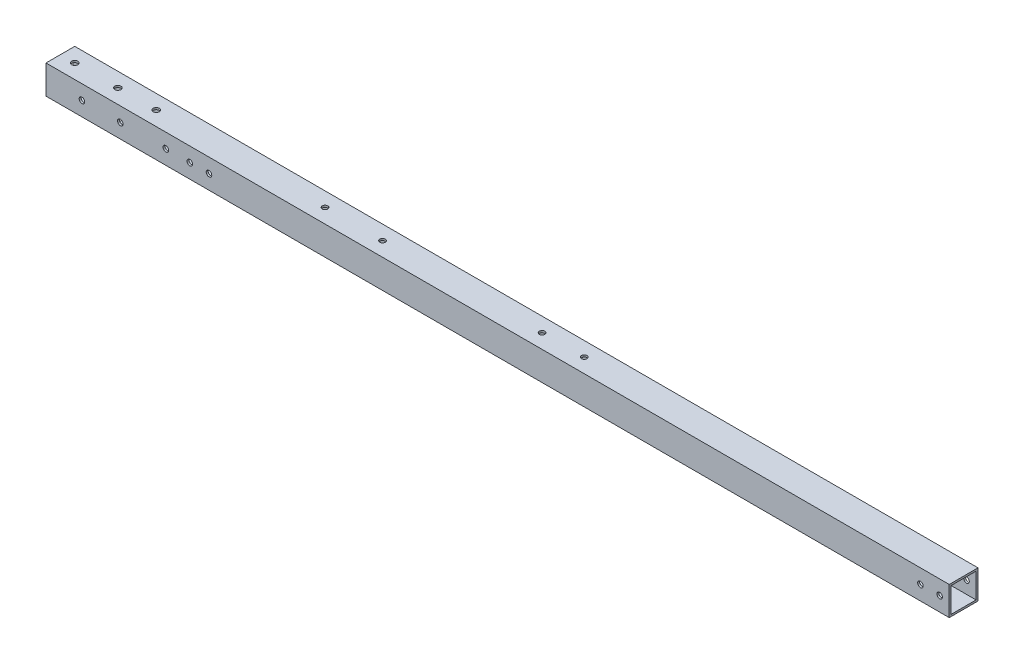
ISO-10303-21;
HEADER;
FILE_DESCRIPTION(('STEP AP214'),'2;1');
FILE_NAME('part.step','',(''),(''),'','','');
FILE_SCHEMA(('AUTOMOTIVE_DESIGN { 1 0 10303 214 1 1 1 1 }'));
ENDSEC;
DATA;
#1=APPLICATION_CONTEXT('core data for automotive mechanical design processes');
#2=APPLICATION_PROTOCOL_DEFINITION('international standard','automotive_design',2000,#1);
#3=PRODUCT_CONTEXT('',#1,'mechanical');
#4=PRODUCT('Part','Part','',(#3));
#5=PRODUCT_RELATED_PRODUCT_CATEGORY('part','',(#4));
#6=PRODUCT_DEFINITION_FORMATION('','',#4);
#7=PRODUCT_DEFINITION_CONTEXT('part definition',#1,'design');
#8=PRODUCT_DEFINITION('design','',#6,#7);
#9=PRODUCT_DEFINITION_SHAPE('','',#8);
#10=(LENGTH_UNIT() NAMED_UNIT(*) SI_UNIT(.MILLI.,.METRE.));
#11=(NAMED_UNIT(*) PLANE_ANGLE_UNIT() SI_UNIT($,.RADIAN.));
#12=(NAMED_UNIT(*) SI_UNIT($,.STERADIAN.) SOLID_ANGLE_UNIT());
#13=UNCERTAINTY_MEASURE_WITH_UNIT(LENGTH_MEASURE(1.E-05),#10,'distance_accuracy_value','');
#14=(GEOMETRIC_REPRESENTATION_CONTEXT(3) GLOBAL_UNCERTAINTY_ASSIGNED_CONTEXT((#13)) GLOBAL_UNIT_ASSIGNED_CONTEXT((#10,
#11,#12)) REPRESENTATION_CONTEXT('',''));
#15=CARTESIAN_POINT('',(0.,0.,0.));
#16=DIRECTION('',(0.,0.,1.));
#17=DIRECTION('',(1.,0.,0.));
#18=AXIS2_PLACEMENT_3D('',#15,#16,#17);
#19=CARTESIAN_POINT('',(235.5,-6.50000000000001,-6.49999999999999));
#20=DIRECTION('',(0.,0.,1.));
#21=DIRECTION('',(1.,0.,0.));
#22=AXIS2_PLACEMENT_3D('',#19,#20,#21);
#23=PLANE('',#22);
#24=CARTESIAN_POINT('',(230.5,0.,-6.49999999999999));
#25=DIRECTION('',(0.,0.,1.));
#26=DIRECTION('',(1.,0.,0.));
#27=AXIS2_PLACEMENT_3D('',#24,#25,#26);
#28=CIRCLE('',#27,1.45);
#29=CARTESIAN_POINT('',(231.95,0.,-6.49999999999999));
#30=VERTEX_POINT('',#29);
#31=EDGE_CURVE('E253',#30,#30,#28,.T.);
#32=ORIENTED_EDGE('',*,*,#31,.F.);
#33=EDGE_LOOP('',(#32));
#34=FACE_BOUND('',#33,.T.);
#35=CARTESIAN_POINT('',(220.5,0.,-6.49999999999999));
#36=DIRECTION('',(0.,0.,1.));
#37=DIRECTION('',(1.,0.,0.));
#38=AXIS2_PLACEMENT_3D('',#35,#36,#37);
#39=CIRCLE('',#38,1.45);
#40=CARTESIAN_POINT('',(221.95,0.,-6.49999999999999));
#41=VERTEX_POINT('',#40);
#42=EDGE_CURVE('E247',#41,#41,#39,.T.);
#43=ORIENTED_EDGE('',*,*,#42,.F.);
#44=EDGE_LOOP('',(#43));
#45=FACE_BOUND('',#44,.T.);
#46=CARTESIAN_POINT('',(-173.,0.,-6.49999999999999));
#47=DIRECTION('',(0.,0.,1.));
#48=DIRECTION('',(1.,0.,0.));
#49=AXIS2_PLACEMENT_3D('',#46,#47,#48);
#50=CIRCLE('',#49,1.45);
#51=CARTESIAN_POINT('',(-171.55,0.,-6.49999999999999));
#52=VERTEX_POINT('',#51);
#53=EDGE_CURVE('E289',#52,#52,#50,.T.);
#54=ORIENTED_EDGE('',*,*,#53,.F.);
#55=EDGE_LOOP('',(#54));
#56=FACE_BOUND('',#55,.T.);
#57=CARTESIAN_POINT('',(-160.5,0.,-6.49999999999999));
#58=DIRECTION('',(0.,0.,1.));
#59=DIRECTION('',(1.,0.,0.));
#60=AXIS2_PLACEMENT_3D('',#57,#58,#59);
#61=CIRCLE('',#60,1.45);
#62=CARTESIAN_POINT('',(-159.05,0.,-6.49999999999999));
#63=VERTEX_POINT('',#62);
#64=EDGE_CURVE('E283',#63,#63,#61,.T.);
#65=ORIENTED_EDGE('',*,*,#64,.F.);
#66=EDGE_LOOP('',(#65));
#67=FACE_BOUND('',#66,.T.);
#68=CARTESIAN_POINT('',(-150.5,0.,-6.49999999999999));
#69=DIRECTION('',(0.,0.,1.));
#70=DIRECTION('',(1.,0.,0.));
#71=AXIS2_PLACEMENT_3D('',#68,#69,#70);
#72=CIRCLE('',#71,1.45);
#73=CARTESIAN_POINT('',(-149.05,0.,-6.49999999999999));
#74=VERTEX_POINT('',#73);
#75=EDGE_CURVE('E277',#74,#74,#72,.T.);
#76=ORIENTED_EDGE('',*,*,#75,.F.);
#77=EDGE_LOOP('',(#76));
#78=FACE_BOUND('',#77,.T.);
#79=CARTESIAN_POINT('',(-216.75,0.,-6.49999999999999));
#80=DIRECTION('',(0.,0.,1.));
#81=DIRECTION('',(1.,0.,0.));
#82=AXIS2_PLACEMENT_3D('',#79,#80,#81);
#83=CIRCLE('',#82,1.45);
#84=CARTESIAN_POINT('',(-215.3,0.,-6.49999999999999));
#85=VERTEX_POINT('',#84);
#86=EDGE_CURVE('E313',#85,#85,#83,.T.);
#87=ORIENTED_EDGE('',*,*,#86,.F.);
#88=EDGE_LOOP('',(#87));
#89=FACE_BOUND('',#88,.T.);
#90=CARTESIAN_POINT('',(-196.75,0.,-6.49999999999999));
#91=DIRECTION('',(0.,0.,1.));
#92=DIRECTION('',(1.,0.,0.));
#93=AXIS2_PLACEMENT_3D('',#90,#91,#92);
#94=CIRCLE('',#93,1.45);
#95=CARTESIAN_POINT('',(-195.3,0.,-6.49999999999999));
#96=VERTEX_POINT('',#95);
#97=EDGE_CURVE('E307',#96,#96,#94,.T.);
#98=ORIENTED_EDGE('',*,*,#97,.F.);
#99=EDGE_LOOP('',(#98));
#100=FACE_BOUND('',#99,.T.);
#101=DIRECTION('',(0.,1.,0.));
#102=VECTOR('',#101,1.);
#103=CARTESIAN_POINT('',(-235.5,-6.50000000000001,-6.49999999999999));
#104=LINE('',#103,#102);
#105=CARTESIAN_POINT('',(-235.5,-6.50000000000001,-6.49999999999999));
#106=VERTEX_POINT('',#105);
#107=CARTESIAN_POINT('',(-235.5,6.49999999999999,-6.49999999999999));
#108=VERTEX_POINT('',#107);
#109=EDGE_CURVE('E166',#106,#108,#104,.T.);
#110=ORIENTED_EDGE('',*,*,#109,.F.);
#111=DIRECTION('',(-1.,0.,0.));
#112=VECTOR('',#111,1.);
#113=CARTESIAN_POINT('',(235.5,-6.50000000000001,-6.49999999999999));
#114=LINE('',#113,#112);
#115=CARTESIAN_POINT('',(235.5,-6.50000000000001,-6.49999999999999));
#116=VERTEX_POINT('',#115);
#117=EDGE_CURVE('E12',#116,#106,#114,.T.);
#118=ORIENTED_EDGE('',*,*,#117,.F.);
#119=DIRECTION('',(0.,1.,0.));
#120=VECTOR('',#119,1.);
#121=CARTESIAN_POINT('',(235.5,-6.50000000000001,-6.49999999999999));
#122=LINE('',#121,#120);
#123=CARTESIAN_POINT('',(235.5,6.49999999999999,-6.49999999999999));
#124=VERTEX_POINT('',#123);
#125=EDGE_CURVE('E147',#116,#124,#122,.T.);
#126=ORIENTED_EDGE('',*,*,#125,.T.);
#127=DIRECTION('',(-1.,0.,0.));
#128=VECTOR('',#127,1.);
#129=CARTESIAN_POINT('',(235.5,6.49999999999999,-6.49999999999999));
#130=LINE('',#129,#128);
#131=EDGE_CURVE('E78',#124,#108,#130,.T.);
#132=ORIENTED_EDGE('',*,*,#131,.T.);
#133=EDGE_LOOP('',(#110,#118,#126,#132));
#134=FACE_BOUND('',#133,.T.);
#135=ADVANCED_FACE('F59',(#34,#45,#56,#67,#78,#89,#100,#134),#23,.T.);
#136=CARTESIAN_POINT('',(235.5,-6.50000000000001,6.50000000000001));
#137=DIRECTION('',(0.,1.,0.));
#138=DIRECTION('',(0.,0.,1.));
#139=AXIS2_PLACEMENT_3D('',#136,#137,#138);
#140=PLANE('',#139);
#141=CARTESIAN_POINT('',(15.7,-6.50000000000001,0.));
#142=DIRECTION('',(0.,1.,0.));
#143=DIRECTION('',(0.,0.,1.));
#144=AXIS2_PLACEMENT_3D('',#141,#142,#143);
#145=CIRCLE('',#144,1.45);
#146=CARTESIAN_POINT('',(15.7,-6.50000000000001,1.45));
#147=VERTEX_POINT('',#146);
#148=EDGE_CURVE('E229',#147,#147,#145,.T.);
#149=ORIENTED_EDGE('',*,*,#148,.F.);
#150=EDGE_LOOP('',(#149));
#151=FACE_BOUND('',#150,.T.);
#152=CARTESIAN_POINT('',(37.7,-6.50000000000001,0.));
#153=DIRECTION('',(0.,1.,0.));
#154=DIRECTION('',(0.,0.,1.));
#155=AXIS2_PLACEMENT_3D('',#152,#153,#154);
#156=CIRCLE('',#155,1.45);
#157=CARTESIAN_POINT('',(37.7,-6.50000000000001,1.45));
#158=VERTEX_POINT('',#157);
#159=EDGE_CURVE('E209',#158,#158,#156,.T.);
#160=ORIENTED_EDGE('',*,*,#159,.F.);
#161=EDGE_LOOP('',(#160));
#162=FACE_BOUND('',#161,.T.);
#163=CARTESIAN_POINT('',(-97.5,-6.50000000000001,0.));
#164=DIRECTION('',(0.,1.,0.));
#165=DIRECTION('',(0.,0.,1.));
#166=AXIS2_PLACEMENT_3D('',#163,#164,#165);
#167=CIRCLE('',#166,1.45);
#168=CARTESIAN_POINT('',(-97.5,-6.50000000000001,1.45));
#169=VERTEX_POINT('',#168);
#170=EDGE_CURVE('E206',#169,#169,#167,.T.);
#171=ORIENTED_EDGE('',*,*,#170,.F.);
#172=EDGE_LOOP('',(#171));
#173=FACE_BOUND('',#172,.T.);
#174=CARTESIAN_POINT('',(-67.5,-6.50000000000001,0.));
#175=DIRECTION('',(0.,1.,0.));
#176=DIRECTION('',(0.,0.,1.));
#177=AXIS2_PLACEMENT_3D('',#174,#175,#176);
#178=CIRCLE('',#177,1.45);
#179=CARTESIAN_POINT('',(-67.5,-6.50000000000001,1.45));
#180=VERTEX_POINT('',#179);
#181=EDGE_CURVE('E202',#180,#180,#178,.T.);
#182=ORIENTED_EDGE('',*,*,#181,.F.);
#183=EDGE_LOOP('',(#182));
#184=FACE_BOUND('',#183,.T.);
#185=CARTESIAN_POINT('',(-228.,-6.50000000000001,0.));
#186=DIRECTION('',(0.,1.,0.));
#187=DIRECTION('',(0.,0.,1.));
#188=AXIS2_PLACEMENT_3D('',#185,#186,#187);
#189=CIRCLE('',#188,1.60000000000002);
#190=CARTESIAN_POINT('',(-228.,-6.50000000000001,1.60000000000002));
#191=VERTEX_POINT('',#190);
#192=EDGE_CURVE('E160',#191,#191,#189,.T.);
#193=ORIENTED_EDGE('',*,*,#192,.F.);
#194=EDGE_LOOP('',(#193));
#195=FACE_BOUND('',#194,.T.);
#196=CARTESIAN_POINT('',(-185.5,-6.50000000000001,0.));
#197=DIRECTION('',(0.,1.,0.));
#198=DIRECTION('',(0.,0.,1.));
#199=AXIS2_PLACEMENT_3D('',#196,#197,#198);
#200=CIRCLE('',#199,1.60000000000002);
#201=CARTESIAN_POINT('',(-185.5,-6.50000000000001,1.60000000000002));
#202=VERTEX_POINT('',#201);
#203=EDGE_CURVE('E195',#202,#202,#200,.T.);
#204=ORIENTED_EDGE('',*,*,#203,.F.);
#205=EDGE_LOOP('',(#204));
#206=FACE_BOUND('',#205,.T.);
#207=CARTESIAN_POINT('',(-205.5,-6.50000000000001,0.));
#208=DIRECTION('',(0.,1.,0.));
#209=DIRECTION('',(0.,0.,1.));
#210=AXIS2_PLACEMENT_3D('',#207,#208,#209);
#211=CIRCLE('',#210,1.59999999999999);
#212=CARTESIAN_POINT('',(-205.5,-6.50000000000001,1.59999999999999));
#213=VERTEX_POINT('',#212);
#214=EDGE_CURVE('E190',#213,#213,#211,.T.);
#215=ORIENTED_EDGE('',*,*,#214,.F.);
#216=EDGE_LOOP('',(#215));
#217=FACE_BOUND('',#216,.T.);
#218=DIRECTION('',(0.,0.,-1.));
#219=VECTOR('',#218,1.);
#220=CARTESIAN_POINT('',(-235.5,-6.50000000000001,6.50000000000001));
#221=LINE('',#220,#219);
#222=CARTESIAN_POINT('',(-235.5,-6.50000000000001,6.50000000000001));
#223=VERTEX_POINT('',#222);
#224=EDGE_CURVE('E136',#223,#106,#221,.T.);
#225=ORIENTED_EDGE('',*,*,#224,.F.);
#226=DIRECTION('',(-1.,0.,0.));
#227=VECTOR('',#226,1.);
#228=CARTESIAN_POINT('',(235.5,-6.50000000000001,6.50000000000001));
#229=LINE('',#228,#227);
#230=CARTESIAN_POINT('',(235.5,-6.50000000000001,6.50000000000001));
#231=VERTEX_POINT('',#230);
#232=EDGE_CURVE('E69',#231,#223,#229,.T.);
#233=ORIENTED_EDGE('',*,*,#232,.F.);
#234=DIRECTION('',(0.,0.,-1.));
#235=VECTOR('',#234,1.);
#236=CARTESIAN_POINT('',(235.5,-6.50000000000001,6.50000000000001));
#237=LINE('',#236,#235);
#238=EDGE_CURVE('E134',#231,#116,#237,.T.);
#239=ORIENTED_EDGE('',*,*,#238,.T.);
#240=ORIENTED_EDGE('',*,*,#117,.T.);
#241=EDGE_LOOP('',(#225,#233,#239,#240));
#242=FACE_BOUND('',#241,.T.);
#243=ADVANCED_FACE('F133',(#151,#162,#173,#184,#195,#206,#217,#242),#140,.T.);
#244=CARTESIAN_POINT('',(235.5,-6.50000000000001,6.50000000000001));
#245=DIRECTION('',(0.,0.,-1.));
#246=DIRECTION('',(-1.,0.,0.));
#247=AXIS2_PLACEMENT_3D('',#244,#245,#246);
#248=PLANE('',#247);
#249=CARTESIAN_POINT('',(230.5,0.,6.50000000000001));
#250=DIRECTION('',(0.,0.,-1.));
#251=DIRECTION('',(-1.,0.,0.));
#252=AXIS2_PLACEMENT_3D('',#249,#250,#251);
#253=CIRCLE('',#252,1.45);
#254=CARTESIAN_POINT('',(229.05,0.,6.50000000000001));
#255=VERTEX_POINT('',#254);
#256=EDGE_CURVE('E250',#255,#255,#253,.T.);
#257=ORIENTED_EDGE('',*,*,#256,.F.);
#258=EDGE_LOOP('',(#257));
#259=FACE_BOUND('',#258,.T.);
#260=CARTESIAN_POINT('',(220.5,0.,6.50000000000001));
#261=DIRECTION('',(0.,0.,-1.));
#262=DIRECTION('',(-1.,0.,0.));
#263=AXIS2_PLACEMENT_3D('',#260,#261,#262);
#264=CIRCLE('',#263,1.45);
#265=CARTESIAN_POINT('',(219.05,0.,6.50000000000001));
#266=VERTEX_POINT('',#265);
#267=EDGE_CURVE('E236',#266,#266,#264,.T.);
#268=ORIENTED_EDGE('',*,*,#267,.F.);
#269=EDGE_LOOP('',(#268));
#270=FACE_BOUND('',#269,.T.);
#271=CARTESIAN_POINT('',(-173.,0.,6.50000000000001));
#272=DIRECTION('',(0.,0.,-1.));
#273=DIRECTION('',(-1.,0.,0.));
#274=AXIS2_PLACEMENT_3D('',#271,#272,#273);
#275=CIRCLE('',#274,1.45);
#276=CARTESIAN_POINT('',(-174.45,0.,6.50000000000001));
#277=VERTEX_POINT('',#276);
#278=EDGE_CURVE('E286',#277,#277,#275,.T.);
#279=ORIENTED_EDGE('',*,*,#278,.F.);
#280=EDGE_LOOP('',(#279));
#281=FACE_BOUND('',#280,.T.);
#282=CARTESIAN_POINT('',(-160.5,0.,6.50000000000001));
#283=DIRECTION('',(0.,0.,-1.));
#284=DIRECTION('',(-1.,0.,0.));
#285=AXIS2_PLACEMENT_3D('',#282,#283,#284);
#286=CIRCLE('',#285,1.45);
#287=CARTESIAN_POINT('',(-161.95,0.,6.50000000000001));
#288=VERTEX_POINT('',#287);
#289=EDGE_CURVE('E280',#288,#288,#286,.T.);
#290=ORIENTED_EDGE('',*,*,#289,.F.);
#291=EDGE_LOOP('',(#290));
#292=FACE_BOUND('',#291,.T.);
#293=CARTESIAN_POINT('',(-150.5,0.,6.50000000000001));
#294=DIRECTION('',(0.,0.,-1.));
#295=DIRECTION('',(-1.,0.,0.));
#296=AXIS2_PLACEMENT_3D('',#293,#294,#295);
#297=CIRCLE('',#296,1.45);
#298=CARTESIAN_POINT('',(-151.95,0.,6.50000000000001));
#299=VERTEX_POINT('',#298);
#300=EDGE_CURVE('E260',#299,#299,#297,.T.);
#301=ORIENTED_EDGE('',*,*,#300,.F.);
#302=EDGE_LOOP('',(#301));
#303=FACE_BOUND('',#302,.T.);
#304=CARTESIAN_POINT('',(-216.75,0.,6.50000000000001));
#305=DIRECTION('',(0.,0.,-1.));
#306=DIRECTION('',(-1.,0.,0.));
#307=AXIS2_PLACEMENT_3D('',#304,#305,#306);
#308=CIRCLE('',#307,1.45);
#309=CARTESIAN_POINT('',(-218.2,0.,6.50000000000001));
#310=VERTEX_POINT('',#309);
#311=EDGE_CURVE('E310',#310,#310,#308,.T.);
#312=ORIENTED_EDGE('',*,*,#311,.F.);
#313=EDGE_LOOP('',(#312));
#314=FACE_BOUND('',#313,.T.);
#315=CARTESIAN_POINT('',(-196.75,0.,6.50000000000001));
#316=DIRECTION('',(0.,0.,-1.));
#317=DIRECTION('',(-1.,0.,0.));
#318=AXIS2_PLACEMENT_3D('',#315,#316,#317);
#319=CIRCLE('',#318,1.45);
#320=CARTESIAN_POINT('',(-198.2,0.,6.50000000000001));
#321=VERTEX_POINT('',#320);
#322=EDGE_CURVE('E296',#321,#321,#319,.T.);
#323=ORIENTED_EDGE('',*,*,#322,.F.);
#324=EDGE_LOOP('',(#323));
#325=FACE_BOUND('',#324,.T.);
#326=DIRECTION('',(0.,-1.,0.));
#327=VECTOR('',#326,1.);
#328=CARTESIAN_POINT('',(-235.5,-6.50000000000001,6.50000000000001));
#329=LINE('',#328,#327);
#330=CARTESIAN_POINT('',(-235.5,6.49999999999999,6.50000000000001));
#331=VERTEX_POINT('',#330);
#332=EDGE_CURVE('E169',#331,#223,#329,.T.);
#333=ORIENTED_EDGE('',*,*,#332,.F.);
#334=DIRECTION('',(-1.,0.,0.));
#335=VECTOR('',#334,1.);
#336=CARTESIAN_POINT('',(235.5,6.49999999999999,6.50000000000001));
#337=LINE('',#336,#335);
#338=CARTESIAN_POINT('',(235.5,6.49999999999999,6.50000000000001));
#339=VERTEX_POINT('',#338);
#340=EDGE_CURVE('E103',#339,#331,#337,.T.);
#341=ORIENTED_EDGE('',*,*,#340,.F.);
#342=DIRECTION('',(0.,-1.,0.));
#343=VECTOR('',#342,1.);
#344=CARTESIAN_POINT('',(235.5,-6.50000000000001,6.50000000000001));
#345=LINE('',#344,#343);
#346=EDGE_CURVE('E146',#339,#231,#345,.T.);
#347=ORIENTED_EDGE('',*,*,#346,.T.);
#348=ORIENTED_EDGE('',*,*,#232,.T.);
#349=EDGE_LOOP('',(#333,#341,#347,#348));
#350=FACE_BOUND('',#349,.T.);
#351=ADVANCED_FACE('F149',(#259,#270,#281,#292,#303,#314,#325,#350),#248,.T.);
#352=CARTESIAN_POINT('',(235.5,-7.50000000000001,-7.49999999999999));
#353=DIRECTION('',(0.,0.,1.));
#354=DIRECTION('',(1.,0.,0.));
#355=AXIS2_PLACEMENT_3D('',#352,#353,#354);
#356=PLANE('',#355);
#357=CARTESIAN_POINT('',(230.5,0.,-7.49999999999999));
#358=DIRECTION('',(0.,0.,-1.));
#359=DIRECTION('',(-1.,0.,0.));
#360=AXIS2_PLACEMENT_3D('',#357,#358,#359);
#361=CIRCLE('',#360,1.45);
#362=CARTESIAN_POINT('',(229.05,0.,-7.49999999999999));
#363=VERTEX_POINT('',#362);
#364=EDGE_CURVE('E237',#363,#363,#361,.T.);
#365=ORIENTED_EDGE('',*,*,#364,.F.);
#366=EDGE_LOOP('',(#365));
#367=FACE_BOUND('',#366,.T.);
#368=CARTESIAN_POINT('',(220.5,0.,-7.49999999999999));
#369=DIRECTION('',(0.,0.,-1.));
#370=DIRECTION('',(-1.,0.,0.));
#371=AXIS2_PLACEMENT_3D('',#368,#369,#370);
#372=CIRCLE('',#371,1.45);
#373=CARTESIAN_POINT('',(219.05,0.,-7.49999999999999));
#374=VERTEX_POINT('',#373);
#375=EDGE_CURVE('E240',#374,#374,#372,.T.);
#376=ORIENTED_EDGE('',*,*,#375,.F.);
#377=EDGE_LOOP('',(#376));
#378=FACE_BOUND('',#377,.T.);
#379=CARTESIAN_POINT('',(-173.,0.,-7.49999999999999));
#380=DIRECTION('',(0.,0.,-1.));
#381=DIRECTION('',(-1.,0.,0.));
#382=AXIS2_PLACEMENT_3D('',#379,#380,#381);
#383=CIRCLE('',#382,1.45);
#384=CARTESIAN_POINT('',(-174.45,0.,-7.49999999999999));
#385=VERTEX_POINT('',#384);
#386=EDGE_CURVE('E261',#385,#385,#383,.T.);
#387=ORIENTED_EDGE('',*,*,#386,.F.);
#388=EDGE_LOOP('',(#387));
#389=FACE_BOUND('',#388,.T.);
#390=CARTESIAN_POINT('',(-160.5,0.,-7.49999999999999));
#391=DIRECTION('',(0.,0.,-1.));
#392=DIRECTION('',(-1.,0.,0.));
#393=AXIS2_PLACEMENT_3D('',#390,#391,#392);
#394=CIRCLE('',#393,1.45);
#395=CARTESIAN_POINT('',(-161.95,0.,-7.49999999999999));
#396=VERTEX_POINT('',#395);
#397=EDGE_CURVE('E264',#396,#396,#394,.T.);
#398=ORIENTED_EDGE('',*,*,#397,.F.);
#399=EDGE_LOOP('',(#398));
#400=FACE_BOUND('',#399,.T.);
#401=CARTESIAN_POINT('',(-150.5,0.,-7.49999999999999));
#402=DIRECTION('',(0.,0.,-1.));
#403=DIRECTION('',(-1.,0.,0.));
#404=AXIS2_PLACEMENT_3D('',#401,#402,#403);
#405=CIRCLE('',#404,1.45);
#406=CARTESIAN_POINT('',(-151.95,0.,-7.49999999999999));
#407=VERTEX_POINT('',#406);
#408=EDGE_CURVE('E270',#407,#407,#405,.T.);
#409=ORIENTED_EDGE('',*,*,#408,.F.);
#410=EDGE_LOOP('',(#409));
#411=FACE_BOUND('',#410,.T.);
#412=CARTESIAN_POINT('',(-216.75,0.,-7.49999999999999));
#413=DIRECTION('',(0.,0.,-1.));
#414=DIRECTION('',(-1.,0.,0.));
#415=AXIS2_PLACEMENT_3D('',#412,#413,#414);
#416=CIRCLE('',#415,1.45);
#417=CARTESIAN_POINT('',(-218.2,0.,-7.49999999999999));
#418=VERTEX_POINT('',#417);
#419=EDGE_CURVE('E297',#418,#418,#416,.T.);
#420=ORIENTED_EDGE('',*,*,#419,.F.);
#421=EDGE_LOOP('',(#420));
#422=FACE_BOUND('',#421,.T.);
#423=CARTESIAN_POINT('',(-196.75,0.,-7.49999999999999));
#424=DIRECTION('',(0.,0.,-1.));
#425=DIRECTION('',(-1.,0.,0.));
#426=AXIS2_PLACEMENT_3D('',#423,#424,#425);
#427=CIRCLE('',#426,1.45);
#428=CARTESIAN_POINT('',(-198.2,0.,-7.49999999999999));
#429=VERTEX_POINT('',#428);
#430=EDGE_CURVE('E300',#429,#429,#427,.T.);
#431=ORIENTED_EDGE('',*,*,#430,.F.);
#432=EDGE_LOOP('',(#431));
#433=FACE_BOUND('',#432,.T.);
#434=DIRECTION('',(0.,1.,0.));
#435=VECTOR('',#434,1.);
#436=CARTESIAN_POINT('',(-235.5,-7.50000000000001,-7.49999999999999));
#437=LINE('',#436,#435);
#438=CARTESIAN_POINT('',(-235.5,-7.50000000000001,-7.49999999999999));
#439=VERTEX_POINT('',#438);
#440=CARTESIAN_POINT('',(-235.5,7.49999999999999,-7.49999999999999));
#441=VERTEX_POINT('',#440);
#442=EDGE_CURVE('E156',#439,#441,#437,.T.);
#443=ORIENTED_EDGE('',*,*,#442,.T.);
#444=DIRECTION('',(-1.,0.,0.));
#445=VECTOR('',#444,1.);
#446=CARTESIAN_POINT('',(235.5,7.49999999999999,-7.49999999999999));
#447=LINE('',#446,#445);
#448=CARTESIAN_POINT('',(235.5,7.49999999999999,-7.49999999999999));
#449=VERTEX_POINT('',#448);
#450=EDGE_CURVE('E176',#449,#441,#447,.T.);
#451=ORIENTED_EDGE('',*,*,#450,.F.);
#452=DIRECTION('',(0.,1.,0.));
#453=VECTOR('',#452,1.);
#454=CARTESIAN_POINT('',(235.5,-7.50000000000001,-7.49999999999999));
#455=LINE('',#454,#453);
#456=CARTESIAN_POINT('',(235.5,-7.50000000000001,-7.49999999999999));
#457=VERTEX_POINT('',#456);
#458=EDGE_CURVE('E174',#457,#449,#455,.T.);
#459=ORIENTED_EDGE('',*,*,#458,.F.);
#460=DIRECTION('',(-1.,0.,0.));
#461=VECTOR('',#460,1.);
#462=CARTESIAN_POINT('',(235.5,-7.50000000000001,-7.49999999999999));
#463=LINE('',#462,#461);
#464=EDGE_CURVE('E152',#457,#439,#463,.T.);
#465=ORIENTED_EDGE('',*,*,#464,.T.);
#466=EDGE_LOOP('',(#443,#451,#459,#465));
#467=FACE_BOUND('',#466,.T.);
#468=ADVANCED_FACE('F61',(#367,#378,#389,#400,#411,#422,#433,#467),#356,.F.);
#469=CARTESIAN_POINT('',(235.5,7.49999999999999,7.50000000000001));
#470=DIRECTION('',(0.,-1.,0.));
#471=DIRECTION('',(0.,0.,-1.));
#472=AXIS2_PLACEMENT_3D('',#469,#470,#471);
#473=PLANE('',#472);
#474=CARTESIAN_POINT('',(15.7,7.49999999999999,0.));
#475=DIRECTION('',(0.,-1.,0.));
#476=DIRECTION('',(0.,0.,-1.));
#477=AXIS2_PLACEMENT_3D('',#474,#475,#476);
#478=CIRCLE('',#477,1.45);
#479=CARTESIAN_POINT('',(15.7,7.49999999999999,-1.45));
#480=VERTEX_POINT('',#479);
#481=EDGE_CURVE('E210',#480,#480,#478,.T.);
#482=ORIENTED_EDGE('',*,*,#481,.T.);
#483=EDGE_LOOP('',(#482));
#484=FACE_BOUND('',#483,.T.);
#485=CARTESIAN_POINT('',(37.7,7.49999999999999,0.));
#486=DIRECTION('',(0.,-1.,0.));
#487=DIRECTION('',(0.,0.,-1.));
#488=AXIS2_PLACEMENT_3D('',#485,#486,#487);
#489=CIRCLE('',#488,1.45);
#490=CARTESIAN_POINT('',(37.7,7.49999999999999,-1.45));
#491=VERTEX_POINT('',#490);
#492=EDGE_CURVE('E226',#491,#491,#489,.T.);
#493=ORIENTED_EDGE('',*,*,#492,.T.);
#494=EDGE_LOOP('',(#493));
#495=FACE_BOUND('',#494,.T.);
#496=CARTESIAN_POINT('',(-97.5,7.49999999999999,0.));
#497=DIRECTION('',(0.,1.,0.));
#498=DIRECTION('',(0.,0.,1.));
#499=AXIS2_PLACEMENT_3D('',#496,#497,#498);
#500=CIRCLE('',#499,1.45);
#501=CARTESIAN_POINT('',(-97.5,7.49999999999999,1.45));
#502=VERTEX_POINT('',#501);
#503=EDGE_CURVE('E319',#502,#502,#500,.T.);
#504=ORIENTED_EDGE('',*,*,#503,.F.);
#505=EDGE_LOOP('',(#504));
#506=FACE_BOUND('',#505,.T.);
#507=CARTESIAN_POINT('',(-67.5,7.49999999999999,0.));
#508=DIRECTION('',(0.,1.,0.));
#509=DIRECTION('',(0.,0.,1.));
#510=AXIS2_PLACEMENT_3D('',#507,#508,#509);
#511=CIRCLE('',#510,1.45);
#512=CARTESIAN_POINT('',(-67.5,7.49999999999999,1.45));
#513=VERTEX_POINT('',#512);
#514=EDGE_CURVE('E322',#513,#513,#511,.T.);
#515=ORIENTED_EDGE('',*,*,#514,.F.);
#516=EDGE_LOOP('',(#515));
#517=FACE_BOUND('',#516,.T.);
#518=CARTESIAN_POINT('',(-228.,7.49999999999999,0.));
#519=DIRECTION('',(0.,1.,0.));
#520=DIRECTION('',(0.,0.,1.));
#521=AXIS2_PLACEMENT_3D('',#518,#519,#520);
#522=CIRCLE('',#521,1.60000000000002);
#523=CARTESIAN_POINT('',(-228.,7.49999999999999,1.60000000000002));
#524=VERTEX_POINT('',#523);
#525=EDGE_CURVE('E339',#524,#524,#522,.T.);
#526=ORIENTED_EDGE('',*,*,#525,.F.);
#527=EDGE_LOOP('',(#526));
#528=FACE_BOUND('',#527,.T.);
#529=CARTESIAN_POINT('',(-185.5,7.49999999999999,0.));
#530=DIRECTION('',(0.,1.,0.));
#531=DIRECTION('',(0.,0.,1.));
#532=AXIS2_PLACEMENT_3D('',#529,#530,#531);
#533=CIRCLE('',#532,1.60000000000002);
#534=CARTESIAN_POINT('',(-185.5,7.49999999999999,1.60000000000002));
#535=VERTEX_POINT('',#534);
#536=EDGE_CURVE('E332',#535,#535,#533,.T.);
#537=ORIENTED_EDGE('',*,*,#536,.F.);
#538=EDGE_LOOP('',(#537));
#539=FACE_BOUND('',#538,.T.);
#540=CARTESIAN_POINT('',(-205.5,7.49999999999999,0.));
#541=DIRECTION('',(0.,1.,0.));
#542=DIRECTION('',(0.,0.,1.));
#543=AXIS2_PLACEMENT_3D('',#540,#541,#542);
#544=CIRCLE('',#543,1.59999999999999);
#545=CARTESIAN_POINT('',(-205.5,7.49999999999999,1.59999999999999));
#546=VERTEX_POINT('',#545);
#547=EDGE_CURVE('E335',#546,#546,#544,.T.);
#548=ORIENTED_EDGE('',*,*,#547,.F.);
#549=EDGE_LOOP('',(#548));
#550=FACE_BOUND('',#549,.T.);
#551=DIRECTION('',(0.,0.,1.));
#552=VECTOR('',#551,1.);
#553=CARTESIAN_POINT('',(-235.5,7.49999999999999,7.50000000000001));
#554=LINE('',#553,#552);
#555=CARTESIAN_POINT('',(-235.5,7.49999999999999,7.50000000000001));
#556=VERTEX_POINT('',#555);
#557=EDGE_CURVE('E159',#441,#556,#554,.T.);
#558=ORIENTED_EDGE('',*,*,#557,.T.);
#559=DIRECTION('',(-1.,0.,0.));
#560=VECTOR('',#559,1.);
#561=CARTESIAN_POINT('',(235.5,7.49999999999999,7.50000000000001));
#562=LINE('',#561,#560);
#563=CARTESIAN_POINT('',(235.5,7.49999999999999,7.50000000000001));
#564=VERTEX_POINT('',#563);
#565=EDGE_CURVE('E183',#564,#556,#562,.T.);
#566=ORIENTED_EDGE('',*,*,#565,.F.);
#567=DIRECTION('',(0.,0.,1.));
#568=VECTOR('',#567,1.);
#569=CARTESIAN_POINT('',(235.5,7.49999999999999,7.50000000000001));
#570=LINE('',#569,#568);
#571=EDGE_CURVE('E116',#449,#564,#570,.T.);
#572=ORIENTED_EDGE('',*,*,#571,.F.);
#573=ORIENTED_EDGE('',*,*,#450,.T.);
#574=EDGE_LOOP('',(#558,#566,#572,#573));
#575=FACE_BOUND('',#574,.T.);
#576=ADVANCED_FACE('F393',(#484,#495,#506,#517,#528,#539,#550,#575),#473,.F.);
#577=CARTESIAN_POINT('',(235.5,-7.50000000000001,7.49999999999999));
#578=DIRECTION('',(0.,0.,-1.));
#579=DIRECTION('',(0.,1.,0.));
#580=AXIS2_PLACEMENT_3D('',#577,#578,#579);
#581=PLANE('',#580);
#582=CARTESIAN_POINT('',(230.5,0.,7.50000000000001));
#583=DIRECTION('',(0.,0.,-1.));
#584=DIRECTION('',(-1.,0.,0.));
#585=AXIS2_PLACEMENT_3D('',#582,#583,#584);
#586=CIRCLE('',#585,1.45);
#587=CARTESIAN_POINT('',(229.05,0.,7.50000000000001));
#588=VERTEX_POINT('',#587);
#589=EDGE_CURVE('E233',#588,#588,#586,.T.);
#590=ORIENTED_EDGE('',*,*,#589,.T.);
#591=EDGE_LOOP('',(#590));
#592=FACE_BOUND('',#591,.T.);
#593=CARTESIAN_POINT('',(220.5,0.,7.50000000000001));
#594=DIRECTION('',(0.,0.,-1.));
#595=DIRECTION('',(-1.,0.,0.));
#596=AXIS2_PLACEMENT_3D('',#593,#594,#595);
#597=CIRCLE('',#596,1.45);
#598=CARTESIAN_POINT('',(219.05,0.,7.50000000000001));
#599=VERTEX_POINT('',#598);
#600=EDGE_CURVE('E232',#599,#599,#597,.T.);
#601=ORIENTED_EDGE('',*,*,#600,.T.);
#602=EDGE_LOOP('',(#601));
#603=FACE_BOUND('',#602,.T.);
#604=CARTESIAN_POINT('',(-173.,0.,7.50000000000001));
#605=DIRECTION('',(0.,0.,-1.));
#606=DIRECTION('',(-1.,0.,0.));
#607=AXIS2_PLACEMENT_3D('',#604,#605,#606);
#608=CIRCLE('',#607,1.45);
#609=CARTESIAN_POINT('',(-174.45,0.,7.50000000000001));
#610=VERTEX_POINT('',#609);
#611=EDGE_CURVE('E257',#610,#610,#608,.T.);
#612=ORIENTED_EDGE('',*,*,#611,.T.);
#613=EDGE_LOOP('',(#612));
#614=FACE_BOUND('',#613,.T.);
#615=CARTESIAN_POINT('',(-160.5,0.,7.50000000000001));
#616=DIRECTION('',(0.,0.,-1.));
#617=DIRECTION('',(-1.,0.,0.));
#618=AXIS2_PLACEMENT_3D('',#615,#616,#617);
#619=CIRCLE('',#618,1.45);
#620=CARTESIAN_POINT('',(-161.95,0.,7.50000000000001));
#621=VERTEX_POINT('',#620);
#622=EDGE_CURVE('E267',#621,#621,#619,.T.);
#623=ORIENTED_EDGE('',*,*,#622,.T.);
#624=EDGE_LOOP('',(#623));
#625=FACE_BOUND('',#624,.T.);
#626=CARTESIAN_POINT('',(-150.5,0.,7.50000000000001));
#627=DIRECTION('',(0.,0.,-1.));
#628=DIRECTION('',(-1.,0.,0.));
#629=AXIS2_PLACEMENT_3D('',#626,#627,#628);
#630=CIRCLE('',#629,1.45);
#631=CARTESIAN_POINT('',(-151.95,0.,7.50000000000001));
#632=VERTEX_POINT('',#631);
#633=EDGE_CURVE('E256',#632,#632,#630,.T.);
#634=ORIENTED_EDGE('',*,*,#633,.T.);
#635=EDGE_LOOP('',(#634));
#636=FACE_BOUND('',#635,.T.);
#637=CARTESIAN_POINT('',(-216.75,0.,7.50000000000001));
#638=DIRECTION('',(0.,0.,-1.));
#639=DIRECTION('',(-1.,0.,0.));
#640=AXIS2_PLACEMENT_3D('',#637,#638,#639);
#641=CIRCLE('',#640,1.45);
#642=CARTESIAN_POINT('',(-218.2,0.,7.50000000000001));
#643=VERTEX_POINT('',#642);
#644=EDGE_CURVE('E293',#643,#643,#641,.T.);
#645=ORIENTED_EDGE('',*,*,#644,.T.);
#646=EDGE_LOOP('',(#645));
#647=FACE_BOUND('',#646,.T.);
#648=CARTESIAN_POINT('',(-196.75,0.,7.50000000000001));
#649=DIRECTION('',(0.,0.,-1.));
#650=DIRECTION('',(-1.,0.,0.));
#651=AXIS2_PLACEMENT_3D('',#648,#649,#650);
#652=CIRCLE('',#651,1.45);
#653=CARTESIAN_POINT('',(-198.2,0.,7.50000000000001));
#654=VERTEX_POINT('',#653);
#655=EDGE_CURVE('E292',#654,#654,#652,.T.);
#656=ORIENTED_EDGE('',*,*,#655,.T.);
#657=EDGE_LOOP('',(#656));
#658=FACE_BOUND('',#657,.T.);
#659=DIRECTION('',(0.,-1.,0.));
#660=VECTOR('',#659,1.);
#661=CARTESIAN_POINT('',(-235.5,-7.50000000000001,7.49999999999999));
#662=LINE('',#661,#660);
#663=CARTESIAN_POINT('',(-235.5,-7.50000000000001,7.49999999999999));
#664=VERTEX_POINT('',#663);
#665=EDGE_CURVE('E162',#556,#664,#662,.T.);
#666=ORIENTED_EDGE('',*,*,#665,.T.);
#667=DIRECTION('',(-1.,0.,0.));
#668=VECTOR('',#667,1.);
#669=CARTESIAN_POINT('',(235.5,-7.50000000000001,7.49999999999999));
#670=LINE('',#669,#668);
#671=CARTESIAN_POINT('',(235.5,-7.50000000000001,7.49999999999999));
#672=VERTEX_POINT('',#671);
#673=EDGE_CURVE('E180',#672,#664,#670,.T.);
#674=ORIENTED_EDGE('',*,*,#673,.F.);
#675=DIRECTION('',(0.,-1.,0.));
#676=VECTOR('',#675,1.);
#677=CARTESIAN_POINT('',(235.5,-7.50000000000001,7.49999999999999));
#678=LINE('',#677,#676);
#679=EDGE_CURVE('E356',#564,#672,#678,.T.);
#680=ORIENTED_EDGE('',*,*,#679,.F.);
#681=ORIENTED_EDGE('',*,*,#565,.T.);
#682=EDGE_LOOP('',(#666,#674,#680,#681));
#683=FACE_BOUND('',#682,.T.);
#684=ADVANCED_FACE('F372',(#592,#603,#614,#625,#636,#647,#658,#683),#581,.F.);
#685=CARTESIAN_POINT('',(235.5,-7.50000000000001,7.49999999999999));
#686=DIRECTION('',(0.,1.,0.));
#687=DIRECTION('',(0.,0.,1.));
#688=AXIS2_PLACEMENT_3D('',#685,#686,#687);
#689=PLANE('',#688);
#690=CARTESIAN_POINT('',(15.7,-7.50000000000001,0.));
#691=DIRECTION('',(0.,-1.,0.));
#692=DIRECTION('',(0.,0.,-1.));
#693=AXIS2_PLACEMENT_3D('',#690,#691,#692);
#694=CIRCLE('',#693,1.45);
#695=CARTESIAN_POINT('',(15.7,-7.50000000000001,-1.45));
#696=VERTEX_POINT('',#695);
#697=EDGE_CURVE('E216',#696,#696,#694,.T.);
#698=ORIENTED_EDGE('',*,*,#697,.F.);
#699=EDGE_LOOP('',(#698));
#700=FACE_BOUND('',#699,.T.);
#701=CARTESIAN_POINT('',(37.7,-7.50000000000001,0.));
#702=DIRECTION('',(0.,-1.,0.));
#703=DIRECTION('',(0.,0.,-1.));
#704=AXIS2_PLACEMENT_3D('',#701,#702,#703);
#705=CIRCLE('',#704,1.45);
#706=CARTESIAN_POINT('',(37.7,-7.50000000000001,-1.45));
#707=VERTEX_POINT('',#706);
#708=EDGE_CURVE('E221',#707,#707,#705,.T.);
#709=ORIENTED_EDGE('',*,*,#708,.F.);
#710=EDGE_LOOP('',(#709));
#711=FACE_BOUND('',#710,.T.);
#712=CARTESIAN_POINT('',(-97.5,-7.50000000000001,0.));
#713=DIRECTION('',(0.,1.,0.));
#714=DIRECTION('',(0.,0.,1.));
#715=AXIS2_PLACEMENT_3D('',#712,#713,#714);
#716=CIRCLE('',#715,1.45);
#717=CARTESIAN_POINT('',(-97.5,-7.50000000000001,1.45));
#718=VERTEX_POINT('',#717);
#719=EDGE_CURVE('E203',#718,#718,#716,.T.);
#720=ORIENTED_EDGE('',*,*,#719,.T.);
#721=EDGE_LOOP('',(#720));
#722=FACE_BOUND('',#721,.T.);
#723=CARTESIAN_POINT('',(-67.5,-7.50000000000001,0.));
#724=DIRECTION('',(0.,1.,0.));
#725=DIRECTION('',(0.,0.,1.));
#726=AXIS2_PLACEMENT_3D('',#723,#724,#725);
#727=CIRCLE('',#726,1.45);
#728=CARTESIAN_POINT('',(-67.5,-7.50000000000001,1.45));
#729=VERTEX_POINT('',#728);
#730=EDGE_CURVE('E316',#729,#729,#727,.T.);
#731=ORIENTED_EDGE('',*,*,#730,.T.);
#732=EDGE_LOOP('',(#731));
#733=FACE_BOUND('',#732,.T.);
#734=CARTESIAN_POINT('',(-228.,-7.50000000000001,0.));
#735=DIRECTION('',(0.,1.,0.));
#736=DIRECTION('',(0.,0.,1.));
#737=AXIS2_PLACEMENT_3D('',#734,#735,#736);
#738=CIRCLE('',#737,1.60000000000002);
#739=CARTESIAN_POINT('',(-228.,-7.50000000000001,1.60000000000002));
#740=VERTEX_POINT('',#739);
#741=EDGE_CURVE('E331',#740,#740,#738,.T.);
#742=ORIENTED_EDGE('',*,*,#741,.T.);
#743=EDGE_LOOP('',(#742));
#744=FACE_BOUND('',#743,.T.);
#745=CARTESIAN_POINT('',(-185.5,-7.50000000000001,0.));
#746=DIRECTION('',(0.,1.,0.));
#747=DIRECTION('',(0.,0.,1.));
#748=AXIS2_PLACEMENT_3D('',#745,#746,#747);
#749=CIRCLE('',#748,1.60000000000002);
#750=CARTESIAN_POINT('',(-185.5,-7.50000000000001,1.60000000000002));
#751=VERTEX_POINT('',#750);
#752=EDGE_CURVE('E336',#751,#751,#749,.T.);
#753=ORIENTED_EDGE('',*,*,#752,.T.);
#754=EDGE_LOOP('',(#753));
#755=FACE_BOUND('',#754,.T.);
#756=CARTESIAN_POINT('',(-205.5,-7.50000000000001,0.));
#757=DIRECTION('',(0.,1.,0.));
#758=DIRECTION('',(0.,0.,1.));
#759=AXIS2_PLACEMENT_3D('',#756,#757,#758);
#760=CIRCLE('',#759,1.59999999999999);
#761=CARTESIAN_POINT('',(-205.5,-7.50000000000001,1.59999999999999));
#762=VERTEX_POINT('',#761);
#763=EDGE_CURVE('E191',#762,#762,#760,.T.);
#764=ORIENTED_EDGE('',*,*,#763,.T.);
#765=EDGE_LOOP('',(#764));
#766=FACE_BOUND('',#765,.T.);
#767=DIRECTION('',(0.,0.,-1.));
#768=VECTOR('',#767,1.);
#769=CARTESIAN_POINT('',(-235.5,-7.50000000000001,7.49999999999999));
#770=LINE('',#769,#768);
#771=EDGE_CURVE('E164',#664,#439,#770,.T.);
#772=ORIENTED_EDGE('',*,*,#771,.T.);
#773=ORIENTED_EDGE('',*,*,#464,.F.);
#774=DIRECTION('',(0.,0.,-1.));
#775=VECTOR('',#774,1.);
#776=CARTESIAN_POINT('',(235.5,-7.50000000000001,7.49999999999999));
#777=LINE('',#776,#775);
#778=EDGE_CURVE('E358',#672,#457,#777,.T.);
#779=ORIENTED_EDGE('',*,*,#778,.F.);
#780=ORIENTED_EDGE('',*,*,#673,.T.);
#781=EDGE_LOOP('',(#772,#773,#779,#780));
#782=FACE_BOUND('',#781,.T.);
#783=ADVANCED_FACE('F361',(#700,#711,#722,#733,#744,#755,#766,#782),#689,.F.);
#784=CARTESIAN_POINT('',(235.5,6.49999999999999,6.50000000000001));
#785=DIRECTION('',(0.,-1.,0.));
#786=DIRECTION('',(0.,0.,-1.));
#787=AXIS2_PLACEMENT_3D('',#784,#785,#786);
#788=PLANE('',#787);
#789=CARTESIAN_POINT('',(15.7,6.49999999999999,0.));
#790=DIRECTION('',(0.,-1.,0.));
#791=DIRECTION('',(0.,0.,-1.));
#792=AXIS2_PLACEMENT_3D('',#789,#790,#791);
#793=CIRCLE('',#792,1.45);
#794=CARTESIAN_POINT('',(15.7,6.49999999999999,-1.45));
#795=VERTEX_POINT('',#794);
#796=EDGE_CURVE('E63',#795,#795,#793,.T.);
#797=ORIENTED_EDGE('',*,*,#796,.F.);
#798=EDGE_LOOP('',(#797));
#799=FACE_BOUND('',#798,.T.);
#800=CARTESIAN_POINT('',(37.7,6.49999999999999,0.));
#801=DIRECTION('',(0.,-1.,0.));
#802=DIRECTION('',(0.,0.,-1.));
#803=AXIS2_PLACEMENT_3D('',#800,#801,#802);
#804=CIRCLE('',#803,1.45);
#805=CARTESIAN_POINT('',(37.7,6.49999999999999,-1.45));
#806=VERTEX_POINT('',#805);
#807=EDGE_CURVE('E207',#806,#806,#804,.T.);
#808=ORIENTED_EDGE('',*,*,#807,.F.);
#809=EDGE_LOOP('',(#808));
#810=FACE_BOUND('',#809,.T.);
#811=CARTESIAN_POINT('',(-97.5,6.49999999999999,0.));
#812=DIRECTION('',(0.,-1.,0.));
#813=DIRECTION('',(0.,0.,-1.));
#814=AXIS2_PLACEMENT_3D('',#811,#812,#813);
#815=CIRCLE('',#814,1.45);
#816=CARTESIAN_POINT('',(-97.5,6.49999999999999,-1.45));
#817=VERTEX_POINT('',#816);
#818=EDGE_CURVE('E204',#817,#817,#815,.T.);
#819=ORIENTED_EDGE('',*,*,#818,.F.);
#820=EDGE_LOOP('',(#819));
#821=FACE_BOUND('',#820,.T.);
#822=CARTESIAN_POINT('',(-67.5,6.49999999999999,0.));
#823=DIRECTION('',(0.,-1.,0.));
#824=DIRECTION('',(0.,0.,-1.));
#825=AXIS2_PLACEMENT_3D('',#822,#823,#824);
#826=CIRCLE('',#825,1.45);
#827=CARTESIAN_POINT('',(-67.5,6.49999999999999,-1.45));
#828=VERTEX_POINT('',#827);
#829=EDGE_CURVE('E199',#828,#828,#826,.T.);
#830=ORIENTED_EDGE('',*,*,#829,.F.);
#831=EDGE_LOOP('',(#830));
#832=FACE_BOUND('',#831,.T.);
#833=CARTESIAN_POINT('',(-228.,6.49999999999999,0.));
#834=DIRECTION('',(0.,-1.,0.));
#835=DIRECTION('',(0.,0.,-1.));
#836=AXIS2_PLACEMENT_3D('',#833,#834,#835);
#837=CIRCLE('',#836,1.60000000000002);
#838=CARTESIAN_POINT('',(-228.,6.49999999999999,-1.60000000000002));
#839=VERTEX_POINT('',#838);
#840=EDGE_CURVE('E196',#839,#839,#837,.T.);
#841=ORIENTED_EDGE('',*,*,#840,.F.);
#842=EDGE_LOOP('',(#841));
#843=FACE_BOUND('',#842,.T.);
#844=CARTESIAN_POINT('',(-185.5,6.49999999999999,0.));
#845=DIRECTION('',(0.,-1.,0.));
#846=DIRECTION('',(0.,0.,-1.));
#847=AXIS2_PLACEMENT_3D('',#844,#845,#846);
#848=CIRCLE('',#847,1.60000000000002);
#849=CARTESIAN_POINT('',(-185.5,6.49999999999999,-1.60000000000002));
#850=VERTEX_POINT('',#849);
#851=EDGE_CURVE('E192',#850,#850,#848,.T.);
#852=ORIENTED_EDGE('',*,*,#851,.F.);
#853=EDGE_LOOP('',(#852));
#854=FACE_BOUND('',#853,.T.);
#855=CARTESIAN_POINT('',(-205.5,6.49999999999999,0.));
#856=DIRECTION('',(0.,-1.,0.));
#857=DIRECTION('',(0.,0.,-1.));
#858=AXIS2_PLACEMENT_3D('',#855,#856,#857);
#859=CIRCLE('',#858,1.59999999999999);
#860=CARTESIAN_POINT('',(-205.5,6.49999999999999,-1.59999999999999));
#861=VERTEX_POINT('',#860);
#862=EDGE_CURVE('E187',#861,#861,#859,.T.);
#863=ORIENTED_EDGE('',*,*,#862,.F.);
#864=EDGE_LOOP('',(#863));
#865=FACE_BOUND('',#864,.T.);
#866=DIRECTION('',(0.,0.,1.));
#867=VECTOR('',#866,1.);
#868=CARTESIAN_POINT('',(-235.5,6.49999999999999,6.50000000000001));
#869=LINE('',#868,#867);
#870=EDGE_CURVE('E171',#108,#331,#869,.T.);
#871=ORIENTED_EDGE('',*,*,#870,.F.);
#872=ORIENTED_EDGE('',*,*,#131,.F.);
#873=DIRECTION('',(0.,0.,1.));
#874=VECTOR('',#873,1.);
#875=CARTESIAN_POINT('',(235.5,6.49999999999999,6.50000000000001));
#876=LINE('',#875,#874);
#877=EDGE_CURVE('E150',#124,#339,#876,.T.);
#878=ORIENTED_EDGE('',*,*,#877,.T.);
#879=ORIENTED_EDGE('',*,*,#340,.T.);
#880=EDGE_LOOP('',(#871,#872,#878,#879));
#881=FACE_BOUND('',#880,.T.);
#882=ADVANCED_FACE('F359',(#799,#810,#821,#832,#843,#854,#865,#881),#788,.T.);
#883=CARTESIAN_POINT('',(235.5,0.,0.));
#884=DIRECTION('',(-1.,0.,0.));
#885=DIRECTION('',(0.,0.,1.));
#886=AXIS2_PLACEMENT_3D('',#883,#884,#885);
#887=PLANE('',#886);
#888=ORIENTED_EDGE('',*,*,#458,.T.);
#889=ORIENTED_EDGE('',*,*,#571,.T.);
#890=ORIENTED_EDGE('',*,*,#679,.T.);
#891=ORIENTED_EDGE('',*,*,#778,.T.);
#892=EDGE_LOOP('',(#888,#889,#890,#891));
#893=FACE_BOUND('',#892,.T.);
#894=ORIENTED_EDGE('',*,*,#125,.F.);
#895=ORIENTED_EDGE('',*,*,#238,.F.);
#896=ORIENTED_EDGE('',*,*,#346,.F.);
#897=ORIENTED_EDGE('',*,*,#877,.F.);
#898=EDGE_LOOP('',(#894,#895,#896,#897));
#899=FACE_BOUND('',#898,.T.);
#900=ADVANCED_FACE('F144',(#893,#899),#887,.F.);
#901=CARTESIAN_POINT('',(-235.5,0.,0.));
#902=DIRECTION('',(-1.,0.,0.));
#903=DIRECTION('',(0.,0.,1.));
#904=AXIS2_PLACEMENT_3D('',#901,#902,#903);
#905=PLANE('',#904);
#906=ORIENTED_EDGE('',*,*,#442,.F.);
#907=ORIENTED_EDGE('',*,*,#771,.F.);
#908=ORIENTED_EDGE('',*,*,#665,.F.);
#909=ORIENTED_EDGE('',*,*,#557,.F.);
#910=EDGE_LOOP('',(#906,#907,#908,#909));
#911=FACE_BOUND('',#910,.T.);
#912=ORIENTED_EDGE('',*,*,#109,.T.);
#913=ORIENTED_EDGE('',*,*,#870,.T.);
#914=ORIENTED_EDGE('',*,*,#332,.T.);
#915=ORIENTED_EDGE('',*,*,#224,.T.);
#916=EDGE_LOOP('',(#912,#913,#914,#915));
#917=FACE_BOUND('',#916,.T.);
#918=ADVANCED_FACE('F369',(#911,#917),#905,.T.);
#919=CARTESIAN_POINT('',(-205.5,-7.50000000000001,0.));
#920=DIRECTION('',(0.,1.,0.));
#921=DIRECTION('',(0.,0.,1.));
#922=AXIS2_PLACEMENT_3D('',#919,#920,#921);
#923=CYLINDRICAL_SURFACE('',#922,1.59999999999999);
#924=ORIENTED_EDGE('',*,*,#862,.T.);
#925=EDGE_LOOP('',(#924));
#926=FACE_BOUND('',#925,.T.);
#927=ORIENTED_EDGE('',*,*,#547,.T.);
#928=EDGE_LOOP('',(#927));
#929=FACE_BOUND('',#928,.T.);
#930=ADVANCED_FACE('F427',(#926,#929),#923,.F.);
#931=CARTESIAN_POINT('',(-185.5,-7.50000000000001,0.));
#932=DIRECTION('',(0.,1.,0.));
#933=DIRECTION('',(0.,0.,1.));
#934=AXIS2_PLACEMENT_3D('',#931,#932,#933);
#935=CYLINDRICAL_SURFACE('',#934,1.60000000000002);
#936=ORIENTED_EDGE('',*,*,#851,.T.);
#937=EDGE_LOOP('',(#936));
#938=FACE_BOUND('',#937,.T.);
#939=ORIENTED_EDGE('',*,*,#536,.T.);
#940=EDGE_LOOP('',(#939));
#941=FACE_BOUND('',#940,.T.);
#942=ADVANCED_FACE('F431',(#938,#941),#935,.F.);
#943=CARTESIAN_POINT('',(-228.,-7.50000000000001,0.));
#944=DIRECTION('',(0.,1.,0.));
#945=DIRECTION('',(0.,0.,1.));
#946=AXIS2_PLACEMENT_3D('',#943,#944,#945);
#947=CYLINDRICAL_SURFACE('',#946,1.60000000000002);
#948=ORIENTED_EDGE('',*,*,#840,.T.);
#949=EDGE_LOOP('',(#948));
#950=FACE_BOUND('',#949,.T.);
#951=ORIENTED_EDGE('',*,*,#525,.T.);
#952=EDGE_LOOP('',(#951));
#953=FACE_BOUND('',#952,.T.);
#954=ADVANCED_FACE('F436',(#950,#953),#947,.F.);
#955=ORIENTED_EDGE('',*,*,#214,.T.);
#956=EDGE_LOOP('',(#955));
#957=FACE_BOUND('',#956,.T.);
#958=ORIENTED_EDGE('',*,*,#763,.F.);
#959=EDGE_LOOP('',(#958));
#960=FACE_BOUND('',#959,.T.);
#961=ADVANCED_FACE('F434',(#957,#960),#923,.F.);
#962=ORIENTED_EDGE('',*,*,#203,.T.);
#963=EDGE_LOOP('',(#962));
#964=FACE_BOUND('',#963,.T.);
#965=ORIENTED_EDGE('',*,*,#752,.F.);
#966=EDGE_LOOP('',(#965));
#967=FACE_BOUND('',#966,.T.);
#968=ADVANCED_FACE('F444',(#964,#967),#935,.F.);
#969=ORIENTED_EDGE('',*,*,#192,.T.);
#970=EDGE_LOOP('',(#969));
#971=FACE_BOUND('',#970,.T.);
#972=ORIENTED_EDGE('',*,*,#741,.F.);
#973=EDGE_LOOP('',(#972));
#974=FACE_BOUND('',#973,.T.);
#975=ADVANCED_FACE('F440',(#971,#974),#947,.F.);
#976=CARTESIAN_POINT('',(-67.5,-7.50000000000001,0.));
#977=DIRECTION('',(0.,1.,0.));
#978=DIRECTION('',(0.,0.,1.));
#979=AXIS2_PLACEMENT_3D('',#976,#977,#978);
#980=CYLINDRICAL_SURFACE('',#979,1.45);
#981=ORIENTED_EDGE('',*,*,#829,.T.);
#982=EDGE_LOOP('',(#981));
#983=FACE_BOUND('',#982,.T.);
#984=ORIENTED_EDGE('',*,*,#514,.T.);
#985=EDGE_LOOP('',(#984));
#986=FACE_BOUND('',#985,.T.);
#987=ADVANCED_FACE('F445',(#983,#986),#980,.F.);
#988=CARTESIAN_POINT('',(-97.5,-7.50000000000001,0.));
#989=DIRECTION('',(0.,1.,0.));
#990=DIRECTION('',(0.,0.,1.));
#991=AXIS2_PLACEMENT_3D('',#988,#989,#990);
#992=CYLINDRICAL_SURFACE('',#991,1.45);
#993=ORIENTED_EDGE('',*,*,#818,.T.);
#994=EDGE_LOOP('',(#993));
#995=FACE_BOUND('',#994,.T.);
#996=ORIENTED_EDGE('',*,*,#503,.T.);
#997=EDGE_LOOP('',(#996));
#998=FACE_BOUND('',#997,.T.);
#999=ADVANCED_FACE('F448',(#995,#998),#992,.F.);
#1000=ORIENTED_EDGE('',*,*,#181,.T.);
#1001=EDGE_LOOP('',(#1000));
#1002=FACE_BOUND('',#1001,.T.);
#1003=ORIENTED_EDGE('',*,*,#730,.F.);
#1004=EDGE_LOOP('',(#1003));
#1005=FACE_BOUND('',#1004,.T.);
#1006=ADVANCED_FACE('F450',(#1002,#1005),#980,.F.);
#1007=ORIENTED_EDGE('',*,*,#170,.T.);
#1008=EDGE_LOOP('',(#1007));
#1009=FACE_BOUND('',#1008,.T.);
#1010=ORIENTED_EDGE('',*,*,#719,.F.);
#1011=EDGE_LOOP('',(#1010));
#1012=FACE_BOUND('',#1011,.T.);
#1013=ADVANCED_FACE('F454',(#1009,#1012),#992,.F.);
#1014=CARTESIAN_POINT('',(-196.75,0.,7.50000000000001));
#1015=DIRECTION('',(0.,0.,-1.));
#1016=DIRECTION('',(-1.,0.,0.));
#1017=AXIS2_PLACEMENT_3D('',#1014,#1015,#1016);
#1018=CYLINDRICAL_SURFACE('',#1017,1.45);
#1019=ORIENTED_EDGE('',*,*,#322,.T.);
#1020=EDGE_LOOP('',(#1019));
#1021=FACE_BOUND('',#1020,.T.);
#1022=ORIENTED_EDGE('',*,*,#655,.F.);
#1023=EDGE_LOOP('',(#1022));
#1024=FACE_BOUND('',#1023,.T.);
#1025=ADVANCED_FACE('F455',(#1021,#1024),#1018,.F.);
#1026=CARTESIAN_POINT('',(-216.75,0.,7.50000000000001));
#1027=DIRECTION('',(0.,0.,-1.));
#1028=DIRECTION('',(-1.,0.,0.));
#1029=AXIS2_PLACEMENT_3D('',#1026,#1027,#1028);
#1030=CYLINDRICAL_SURFACE('',#1029,1.45);
#1031=ORIENTED_EDGE('',*,*,#311,.T.);
#1032=EDGE_LOOP('',(#1031));
#1033=FACE_BOUND('',#1032,.T.);
#1034=ORIENTED_EDGE('',*,*,#644,.F.);
#1035=EDGE_LOOP('',(#1034));
#1036=FACE_BOUND('',#1035,.T.);
#1037=ADVANCED_FACE('F458',(#1033,#1036),#1030,.F.);
#1038=ORIENTED_EDGE('',*,*,#97,.T.);
#1039=EDGE_LOOP('',(#1038));
#1040=FACE_BOUND('',#1039,.T.);
#1041=ORIENTED_EDGE('',*,*,#430,.T.);
#1042=EDGE_LOOP('',(#1041));
#1043=FACE_BOUND('',#1042,.T.);
#1044=ADVANCED_FACE('F460',(#1040,#1043),#1018,.F.);
#1045=ORIENTED_EDGE('',*,*,#86,.T.);
#1046=EDGE_LOOP('',(#1045));
#1047=FACE_BOUND('',#1046,.T.);
#1048=ORIENTED_EDGE('',*,*,#419,.T.);
#1049=EDGE_LOOP('',(#1048));
#1050=FACE_BOUND('',#1049,.T.);
#1051=ADVANCED_FACE('F464',(#1047,#1050),#1030,.F.);
#1052=CARTESIAN_POINT('',(-150.5,0.,7.50000000000001));
#1053=DIRECTION('',(0.,0.,-1.));
#1054=DIRECTION('',(-1.,0.,0.));
#1055=AXIS2_PLACEMENT_3D('',#1052,#1053,#1054);
#1056=CYLINDRICAL_SURFACE('',#1055,1.45);
#1057=ORIENTED_EDGE('',*,*,#300,.T.);
#1058=EDGE_LOOP('',(#1057));
#1059=FACE_BOUND('',#1058,.T.);
#1060=ORIENTED_EDGE('',*,*,#633,.F.);
#1061=EDGE_LOOP('',(#1060));
#1062=FACE_BOUND('',#1061,.T.);
#1063=ADVANCED_FACE('F465',(#1059,#1062),#1056,.F.);
#1064=CARTESIAN_POINT('',(-160.5,0.,7.50000000000001));
#1065=DIRECTION('',(0.,0.,-1.));
#1066=DIRECTION('',(-1.,0.,0.));
#1067=AXIS2_PLACEMENT_3D('',#1064,#1065,#1066);
#1068=CYLINDRICAL_SURFACE('',#1067,1.45);
#1069=ORIENTED_EDGE('',*,*,#289,.T.);
#1070=EDGE_LOOP('',(#1069));
#1071=FACE_BOUND('',#1070,.T.);
#1072=ORIENTED_EDGE('',*,*,#622,.F.);
#1073=EDGE_LOOP('',(#1072));
#1074=FACE_BOUND('',#1073,.T.);
#1075=ADVANCED_FACE('F468',(#1071,#1074),#1068,.F.);
#1076=CARTESIAN_POINT('',(-173.,0.,7.50000000000001));
#1077=DIRECTION('',(0.,0.,-1.));
#1078=DIRECTION('',(-1.,0.,0.));
#1079=AXIS2_PLACEMENT_3D('',#1076,#1077,#1078);
#1080=CYLINDRICAL_SURFACE('',#1079,1.45);
#1081=ORIENTED_EDGE('',*,*,#278,.T.);
#1082=EDGE_LOOP('',(#1081));
#1083=FACE_BOUND('',#1082,.T.);
#1084=ORIENTED_EDGE('',*,*,#611,.F.);
#1085=EDGE_LOOP('',(#1084));
#1086=FACE_BOUND('',#1085,.T.);
#1087=ADVANCED_FACE('F473',(#1083,#1086),#1080,.F.);
#1088=ORIENTED_EDGE('',*,*,#75,.T.);
#1089=EDGE_LOOP('',(#1088));
#1090=FACE_BOUND('',#1089,.T.);
#1091=ORIENTED_EDGE('',*,*,#408,.T.);
#1092=EDGE_LOOP('',(#1091));
#1093=FACE_BOUND('',#1092,.T.);
#1094=ADVANCED_FACE('F470',(#1090,#1093),#1056,.F.);
#1095=ORIENTED_EDGE('',*,*,#64,.T.);
#1096=EDGE_LOOP('',(#1095));
#1097=FACE_BOUND('',#1096,.T.);
#1098=ORIENTED_EDGE('',*,*,#397,.T.);
#1099=EDGE_LOOP('',(#1098));
#1100=FACE_BOUND('',#1099,.T.);
#1101=ADVANCED_FACE('F475',(#1097,#1100),#1068,.F.);
#1102=ORIENTED_EDGE('',*,*,#53,.T.);
#1103=EDGE_LOOP('',(#1102));
#1104=FACE_BOUND('',#1103,.T.);
#1105=ORIENTED_EDGE('',*,*,#386,.T.);
#1106=EDGE_LOOP('',(#1105));
#1107=FACE_BOUND('',#1106,.T.);
#1108=ADVANCED_FACE('F479',(#1104,#1107),#1080,.F.);
#1109=CARTESIAN_POINT('',(220.5,0.,7.50000000000001));
#1110=DIRECTION('',(0.,0.,-1.));
#1111=DIRECTION('',(-1.,0.,0.));
#1112=AXIS2_PLACEMENT_3D('',#1109,#1110,#1111);
#1113=CYLINDRICAL_SURFACE('',#1112,1.45);
#1114=ORIENTED_EDGE('',*,*,#267,.T.);
#1115=EDGE_LOOP('',(#1114));
#1116=FACE_BOUND('',#1115,.T.);
#1117=ORIENTED_EDGE('',*,*,#600,.F.);
#1118=EDGE_LOOP('',(#1117));
#1119=FACE_BOUND('',#1118,.T.);
#1120=ADVANCED_FACE('F480',(#1116,#1119),#1113,.F.);
#1121=CARTESIAN_POINT('',(230.5,0.,7.50000000000001));
#1122=DIRECTION('',(0.,0.,-1.));
#1123=DIRECTION('',(-1.,0.,0.));
#1124=AXIS2_PLACEMENT_3D('',#1121,#1122,#1123);
#1125=CYLINDRICAL_SURFACE('',#1124,1.45);
#1126=ORIENTED_EDGE('',*,*,#256,.T.);
#1127=EDGE_LOOP('',(#1126));
#1128=FACE_BOUND('',#1127,.T.);
#1129=ORIENTED_EDGE('',*,*,#589,.F.);
#1130=EDGE_LOOP('',(#1129));
#1131=FACE_BOUND('',#1130,.T.);
#1132=ADVANCED_FACE('F483',(#1128,#1131),#1125,.F.);
#1133=ORIENTED_EDGE('',*,*,#42,.T.);
#1134=EDGE_LOOP('',(#1133));
#1135=FACE_BOUND('',#1134,.T.);
#1136=ORIENTED_EDGE('',*,*,#375,.T.);
#1137=EDGE_LOOP('',(#1136));
#1138=FACE_BOUND('',#1137,.T.);
#1139=ADVANCED_FACE('F485',(#1135,#1138),#1113,.F.);
#1140=ORIENTED_EDGE('',*,*,#31,.T.);
#1141=EDGE_LOOP('',(#1140));
#1142=FACE_BOUND('',#1141,.T.);
#1143=ORIENTED_EDGE('',*,*,#364,.T.);
#1144=EDGE_LOOP('',(#1143));
#1145=FACE_BOUND('',#1144,.T.);
#1146=ADVANCED_FACE('F489',(#1142,#1145),#1125,.F.);
#1147=CARTESIAN_POINT('',(37.7,7.49999999999999,0.));
#1148=DIRECTION('',(0.,-1.,0.));
#1149=DIRECTION('',(0.,0.,-1.));
#1150=AXIS2_PLACEMENT_3D('',#1147,#1148,#1149);
#1151=CYLINDRICAL_SURFACE('',#1150,1.45);
#1152=ORIENTED_EDGE('',*,*,#807,.T.);
#1153=EDGE_LOOP('',(#1152));
#1154=FACE_BOUND('',#1153,.T.);
#1155=ORIENTED_EDGE('',*,*,#492,.F.);
#1156=EDGE_LOOP('',(#1155));
#1157=FACE_BOUND('',#1156,.T.);
#1158=ADVANCED_FACE('F490',(#1154,#1157),#1151,.F.);
#1159=CARTESIAN_POINT('',(15.7,7.49999999999999,0.));
#1160=DIRECTION('',(0.,-1.,0.));
#1161=DIRECTION('',(0.,0.,-1.));
#1162=AXIS2_PLACEMENT_3D('',#1159,#1160,#1161);
#1163=CYLINDRICAL_SURFACE('',#1162,1.45);
#1164=ORIENTED_EDGE('',*,*,#796,.T.);
#1165=EDGE_LOOP('',(#1164));
#1166=FACE_BOUND('',#1165,.T.);
#1167=ORIENTED_EDGE('',*,*,#481,.F.);
#1168=EDGE_LOOP('',(#1167));
#1169=FACE_BOUND('',#1168,.T.);
#1170=ADVANCED_FACE('F492',(#1166,#1169),#1163,.F.);
#1171=ORIENTED_EDGE('',*,*,#159,.T.);
#1172=EDGE_LOOP('',(#1171));
#1173=FACE_BOUND('',#1172,.T.);
#1174=ORIENTED_EDGE('',*,*,#708,.T.);
#1175=EDGE_LOOP('',(#1174));
#1176=FACE_BOUND('',#1175,.T.);
#1177=ADVANCED_FACE('F493',(#1173,#1176),#1151,.F.);
#1178=ORIENTED_EDGE('',*,*,#148,.T.);
#1179=EDGE_LOOP('',(#1178));
#1180=FACE_BOUND('',#1179,.T.);
#1181=ORIENTED_EDGE('',*,*,#697,.T.);
#1182=EDGE_LOOP('',(#1181));
#1183=FACE_BOUND('',#1182,.T.);
#1184=ADVANCED_FACE('F496',(#1180,#1183),#1163,.F.);
#1185=CLOSED_SHELL('',(#135,#243,#351,#468,#576,#684,#783,#882,#900,#918,#930,#942,#954,#961,
#968,#975,#987,#999,#1006,#1013,#1025,#1037,#1044,#1051,#1063,#1075,#1087,#1094,#1101,#1108,
#1120,#1132,#1139,#1146,#1158,#1170,#1177,#1184));
#1186=MANIFOLD_SOLID_BREP('B2',#1185);
#1187=ADVANCED_BREP_SHAPE_REPRESENTATION('',(#18,#1186),#14);
#1188=SHAPE_DEFINITION_REPRESENTATION(#9,#1187);
ENDSEC;
END-ISO-10303-21;
